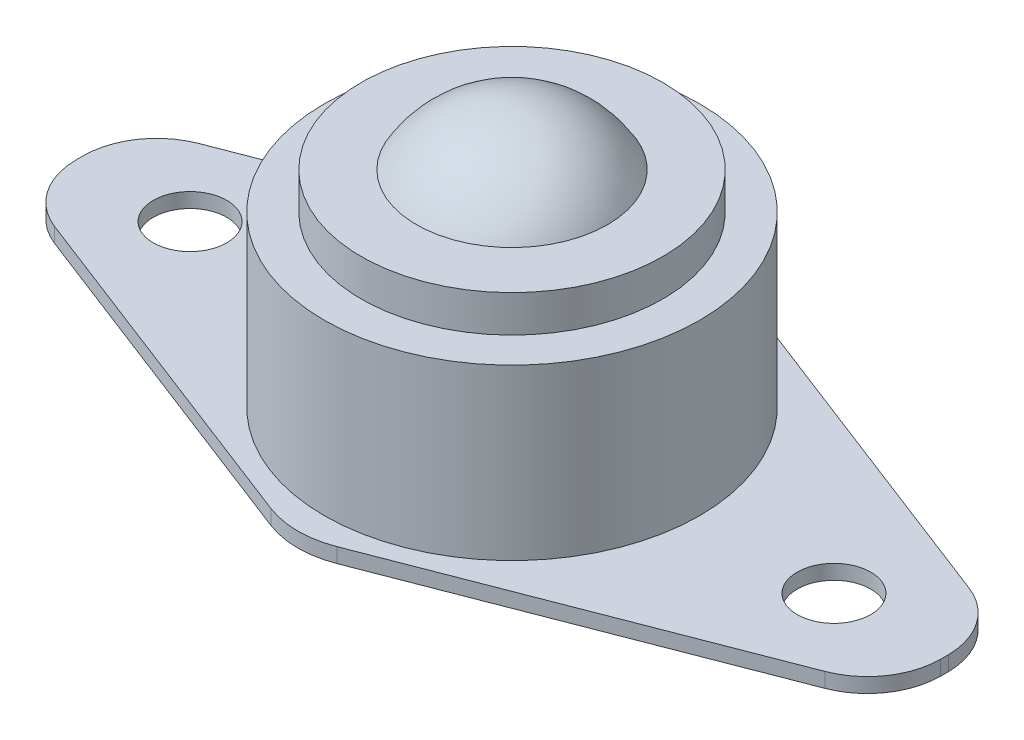
ISO-10303-21;
HEADER;
FILE_DESCRIPTION(('STEP AP214'),'2;1');
FILE_NAME('part.step','',(''),(''),'','','');
FILE_SCHEMA(('AUTOMOTIVE_DESIGN { 1 0 10303 214 1 1 1 1 }'));
ENDSEC;
DATA;
#1=APPLICATION_CONTEXT('core data for automotive mechanical design processes');
#2=APPLICATION_PROTOCOL_DEFINITION('international standard','automotive_design',2000,#1);
#3=PRODUCT_CONTEXT('',#1,'mechanical');
#4=PRODUCT('Part','Part','',(#3));
#5=PRODUCT_RELATED_PRODUCT_CATEGORY('part','',(#4));
#6=PRODUCT_DEFINITION_FORMATION('','',#4);
#7=PRODUCT_DEFINITION_CONTEXT('part definition',#1,'design');
#8=PRODUCT_DEFINITION('design','',#6,#7);
#9=PRODUCT_DEFINITION_SHAPE('','',#8);
#10=(LENGTH_UNIT() NAMED_UNIT(*) SI_UNIT(.MILLI.,.METRE.));
#11=(NAMED_UNIT(*) PLANE_ANGLE_UNIT() SI_UNIT($,.RADIAN.));
#12=(NAMED_UNIT(*) SI_UNIT($,.STERADIAN.) SOLID_ANGLE_UNIT());
#13=UNCERTAINTY_MEASURE_WITH_UNIT(LENGTH_MEASURE(1.E-05),#10,'distance_accuracy_value','');
#14=(GEOMETRIC_REPRESENTATION_CONTEXT(3) GLOBAL_UNCERTAINTY_ASSIGNED_CONTEXT((#13)) GLOBAL_UNIT_ASSIGNED_CONTEXT((#10,
#11,#12)) REPRESENTATION_CONTEXT('',''));
#15=CARTESIAN_POINT('',(0.,0.,0.));
#16=DIRECTION('',(0.,0.,1.));
#17=DIRECTION('',(1.,0.,0.));
#18=AXIS2_PLACEMENT_3D('',#15,#16,#17);
#19=CARTESIAN_POINT('',(-10.1961524227066,0.799999999999998,0.));
#20=DIRECTION('',(0.,-1.,0.));
#21=DIRECTION('',(0.,0.,-1.));
#22=AXIS2_PLACEMENT_3D('',#19,#20,#21);
#23=PLANE('',#22);
#24=CARTESIAN_POINT('',(0.,0.799999999999999,0.));
#25=DIRECTION('',(0.,-1.,0.));
#26=DIRECTION('',(0.,0.,-1.));
#27=AXIS2_PLACEMENT_3D('',#24,#25,#26);
#28=CIRCLE('',#27,10.1961524227066);
#29=CARTESIAN_POINT('',(0.,0.799999999999999,-10.1961524227066));
#30=VERTEX_POINT('',#29);
#31=EDGE_CURVE('E143',#30,#30,#28,.T.);
#32=ORIENTED_EDGE('',*,*,#31,.T.);
#33=EDGE_LOOP('',(#32));
#34=FACE_BOUND('',#33,.T.);
#35=CARTESIAN_POINT('',(17.5,0.799999999999998,0.));
#36=DIRECTION('',(0.,-1.,0.));
#37=DIRECTION('',(0.,0.,-1.));
#38=AXIS2_PLACEMENT_3D('',#35,#36,#37);
#39=CIRCLE('',#38,2.);
#40=CARTESIAN_POINT('',(17.5,0.799999999999998,2.));
#41=VERTEX_POINT('',#40);
#42=EDGE_CURVE('E210',#41,#41,#39,.T.);
#43=ORIENTED_EDGE('',*,*,#42,.T.);
#44=EDGE_LOOP('',(#43));
#45=FACE_BOUND('',#44,.T.);
#46=CARTESIAN_POINT('',(-17.5,0.799999999999998,0.));
#47=DIRECTION('',(0.,-1.,0.));
#48=DIRECTION('',(0.,0.,-1.));
#49=AXIS2_PLACEMENT_3D('',#46,#47,#48);
#50=CIRCLE('',#49,2.);
#51=CARTESIAN_POINT('',(-17.5,0.799999999999998,2.));
#52=VERTEX_POINT('',#51);
#53=EDGE_CURVE('E214',#52,#52,#50,.T.);
#54=ORIENTED_EDGE('',*,*,#53,.T.);
#55=EDGE_LOOP('',(#54));
#56=FACE_BOUND('',#55,.T.);
#57=DIRECTION('',(0.932868850992347,0.,0.360216194594604));
#58=VECTOR('',#57,1.);
#59=CARTESIAN_POINT('',(-12.9055570686898,0.799999999999998,7.01667286729346));
#60=LINE('',#59,#58);
#61=CARTESIAN_POINT('',(-20.9400080375723,0.799999999999998,3.91426533102604));
#62=VERTEX_POINT('',#61);
#63=CARTESIAN_POINT('',(-1.80108097297302,0.799999999999998,11.3045340365359));
#64=VERTEX_POINT('',#63);
#65=EDGE_CURVE('E196',#62,#64,#60,.T.);
#66=ORIENTED_EDGE('',*,*,#65,.T.);
#67=CARTESIAN_POINT('',(0.,0.799999999999999,6.64018978157411));
#68=DIRECTION('',(0.,-1.,0.));
#69=DIRECTION('',(0.,0.,-1.));
#70=AXIS2_PLACEMENT_3D('',#67,#68,#69);
#71=CIRCLE('',#70,5.);
#72=CARTESIAN_POINT('',(1.80108097297302,0.799999999999998,11.3045340365358));
#73=VERTEX_POINT('',#72);
#74=EDGE_CURVE('E177',#64,#73,#71,.F.);
#75=ORIENTED_EDGE('',*,*,#74,.T.);
#76=DIRECTION('',(0.932868850992347,0.,-0.360216194594604));
#77=VECTOR('',#76,1.);
#78=CARTESIAN_POINT('',(-4.84072984724251,0.799999999999998,13.8691901683493));
#79=LINE('',#78,#77);
#80=CARTESIAN_POINT('',(20.9400080375723,0.799999999999998,3.91426533102604));
#81=VERTEX_POINT('',#80);
#82=EDGE_CURVE('E204',#73,#81,#79,.T.);
#83=ORIENTED_EDGE('',*,*,#82,.T.);
#84=CARTESIAN_POINT('',(19.4991432591939,0.799999999999998,0.18278992705665));
#85=DIRECTION('',(0.,-1.,0.));
#86=DIRECTION('',(0.,0.,-1.));
#87=AXIS2_PLACEMENT_3D('',#84,#85,#86);
#88=CIRCLE('',#87,4.);
#89=CARTESIAN_POINT('',(23.4989675174901,0.799999999999997,0.220285296709296));
#90=VERTEX_POINT('',#89);
#91=EDGE_CURVE('E142',#81,#90,#88,.F.);
#92=ORIENTED_EDGE('',*,*,#91,.T.);
#93=CARTESIAN_POINT('',(0.,0.799999999999997,0.));
#94=DIRECTION('',(0.,-1.,0.));
#95=DIRECTION('',(0.,0.,-1.));
#96=AXIS2_PLACEMENT_3D('',#93,#94,#95);
#97=CIRCLE('',#96,23.5);
#98=CARTESIAN_POINT('',(23.4989675174901,0.799999999999997,-0.220285296709296));
#99=VERTEX_POINT('',#98);
#100=EDGE_CURVE('E127',#99,#90,#97,.T.);
#101=ORIENTED_EDGE('',*,*,#100,.F.);
#102=CARTESIAN_POINT('',(19.4991432591939,0.799999999999998,-0.18278992705665));
#103=DIRECTION('',(0.,-1.,0.));
#104=DIRECTION('',(0.,0.,-1.));
#105=AXIS2_PLACEMENT_3D('',#102,#103,#104);
#106=CIRCLE('',#105,4.);
#107=CARTESIAN_POINT('',(20.9400080375723,0.799999999999998,-3.91426533102604));
#108=VERTEX_POINT('',#107);
#109=EDGE_CURVE('E139',#99,#108,#106,.F.);
#110=ORIENTED_EDGE('',*,*,#109,.T.);
#111=DIRECTION('',(0.932868850992347,0.,0.360216194594604));
#112=VECTOR('',#111,1.);
#113=CARTESIAN_POINT('',(-4.84072984724251,0.799999999999998,-13.8691901683493));
#114=LINE('',#113,#112);
#115=CARTESIAN_POINT('',(1.80108097297302,0.799999999999998,-11.3045340365359));
#116=VERTEX_POINT('',#115);
#117=EDGE_CURVE('E206',#116,#108,#114,.T.);
#118=ORIENTED_EDGE('',*,*,#117,.F.);
#119=CARTESIAN_POINT('',(0.,0.799999999999999,-6.64018978157411));
#120=DIRECTION('',(0.,-1.,0.));
#121=DIRECTION('',(0.,0.,-1.));
#122=AXIS2_PLACEMENT_3D('',#119,#120,#121);
#123=CIRCLE('',#122,5.);
#124=CARTESIAN_POINT('',(-1.80108097297302,0.799999999999998,-11.3045340365359));
#125=VERTEX_POINT('',#124);
#126=EDGE_CURVE('E48',#116,#125,#123,.F.);
#127=ORIENTED_EDGE('',*,*,#126,.T.);
#128=DIRECTION('',(0.932868850992347,0.,-0.360216194594604));
#129=VECTOR('',#128,1.);
#130=CARTESIAN_POINT('',(-12.9055570686898,0.799999999999998,-7.01667286729346));
#131=LINE('',#130,#129);
#132=CARTESIAN_POINT('',(-20.9400080375723,0.799999999999998,-3.91426533102604));
#133=VERTEX_POINT('',#132);
#134=EDGE_CURVE('E186',#133,#125,#131,.T.);
#135=ORIENTED_EDGE('',*,*,#134,.F.);
#136=CARTESIAN_POINT('',(-19.4991432591939,0.799999999999998,-0.18278992705665));
#137=DIRECTION('',(0.,-1.,0.));
#138=DIRECTION('',(0.,0.,-1.));
#139=AXIS2_PLACEMENT_3D('',#136,#137,#138);
#140=CIRCLE('',#139,4.);
#141=CARTESIAN_POINT('',(-23.4989675174901,0.799999999999997,-0.220285296709296));
#142=VERTEX_POINT('',#141);
#143=EDGE_CURVE('E152',#133,#142,#140,.F.);
#144=ORIENTED_EDGE('',*,*,#143,.T.);
#145=CARTESIAN_POINT('',(-23.4989675174901,0.799999999999997,0.220285296709296));
#146=VERTEX_POINT('',#145);
#147=EDGE_CURVE('E144',#146,#142,#97,.T.);
#148=ORIENTED_EDGE('',*,*,#147,.F.);
#149=CARTESIAN_POINT('',(-19.4991432591939,0.799999999999998,0.18278992705665));
#150=DIRECTION('',(0.,-1.,0.));
#151=DIRECTION('',(0.,0.,-1.));
#152=AXIS2_PLACEMENT_3D('',#149,#150,#151);
#153=CIRCLE('',#152,4.);
#154=EDGE_CURVE('E149',#146,#62,#153,.F.);
#155=ORIENTED_EDGE('',*,*,#154,.T.);
#156=EDGE_LOOP('',(#66,#75,#83,#92,#101,#110,#118,#127,#135,#144,#148,#155));
#157=FACE_BOUND('',#156,.T.);
#158=ADVANCED_FACE('F33',(#34,#45,#56,#157),#23,.F.);
#159=CARTESIAN_POINT('',(0.,0.,0.));
#160=DIRECTION('',(0.,-1.,0.));
#161=DIRECTION('',(0.,0.,-1.));
#162=AXIS2_PLACEMENT_3D('',#159,#160,#161);
#163=CYLINDRICAL_SURFACE('',#162,23.5);
#164=CARTESIAN_POINT('',(0.,0.,0.));
#165=DIRECTION('',(0.,-1.,0.));
#166=DIRECTION('',(0.,0.,-1.));
#167=AXIS2_PLACEMENT_3D('',#164,#165,#166);
#168=CIRCLE('',#167,23.5);
#169=CARTESIAN_POINT('',(-23.4989675174901,0.,0.220285296709296));
#170=VERTEX_POINT('',#169);
#171=CARTESIAN_POINT('',(-23.4989675174901,0.,-0.220285296709296));
#172=VERTEX_POINT('',#171);
#173=EDGE_CURVE('E217',#170,#172,#168,.T.);
#174=ORIENTED_EDGE('',*,*,#173,.F.);
#175=DIRECTION('',(0.,-1.,0.));
#176=VECTOR('',#175,1.);
#177=CARTESIAN_POINT('',(-23.4989675174901,0.,0.220285296709296));
#178=LINE('',#177,#176);
#179=EDGE_CURVE('E163',#170,#146,#178,.F.);
#180=ORIENTED_EDGE('',*,*,#179,.T.);
#181=ORIENTED_EDGE('',*,*,#147,.T.);
#182=DIRECTION('',(0.,-1.,0.));
#183=VECTOR('',#182,1.);
#184=CARTESIAN_POINT('',(-23.4989675174901,0.,-0.220285296709296));
#185=LINE('',#184,#183);
#186=EDGE_CURVE('E160',#142,#172,#185,.T.);
#187=ORIENTED_EDGE('',*,*,#186,.T.);
#188=EDGE_LOOP('',(#174,#180,#181,#187));
#189=FACE_BOUND('',#188,.T.);
#190=ADVANCED_FACE('F255',(#189),#163,.T.);
#191=ORIENTED_EDGE('',*,*,#100,.T.);
#192=DIRECTION('',(0.,-1.,0.));
#193=VECTOR('',#192,1.);
#194=CARTESIAN_POINT('',(23.4989675174901,0.,0.220285296709296));
#195=LINE('',#194,#193);
#196=CARTESIAN_POINT('',(23.4989675174901,0.,0.220285296709296));
#197=VERTEX_POINT('',#196);
#198=EDGE_CURVE('E134',#90,#197,#195,.T.);
#199=ORIENTED_EDGE('',*,*,#198,.T.);
#200=CARTESIAN_POINT('',(23.4989675174901,0.,-0.220285296709296));
#201=VERTEX_POINT('',#200);
#202=EDGE_CURVE('E130',#201,#197,#168,.T.);
#203=ORIENTED_EDGE('',*,*,#202,.F.);
#204=DIRECTION('',(0.,-1.,0.));
#205=VECTOR('',#204,1.);
#206=CARTESIAN_POINT('',(23.4989675174901,0.,-0.220285296709296));
#207=LINE('',#206,#205);
#208=EDGE_CURVE('E123',#201,#99,#207,.F.);
#209=ORIENTED_EDGE('',*,*,#208,.T.);
#210=EDGE_LOOP('',(#191,#199,#203,#209));
#211=FACE_BOUND('',#210,.T.);
#212=ADVANCED_FACE('F125',(#211),#163,.T.);
#213=CARTESIAN_POINT('',(0.,0.,0.));
#214=DIRECTION('',(0.,1.,0.));
#215=DIRECTION('',(0.,0.,1.));
#216=AXIS2_PLACEMENT_3D('',#213,#214,#215);
#217=PLANE('',#216);
#218=CARTESIAN_POINT('',(17.5,0.,0.));
#219=DIRECTION('',(0.,1.,0.));
#220=DIRECTION('',(0.,0.,1.));
#221=AXIS2_PLACEMENT_3D('',#218,#219,#220);
#222=CIRCLE('',#221,2.);
#223=CARTESIAN_POINT('',(17.5,0.,2.));
#224=VERTEX_POINT('',#223);
#225=EDGE_CURVE('E209',#224,#224,#222,.T.);
#226=ORIENTED_EDGE('',*,*,#225,.T.);
#227=EDGE_LOOP('',(#226));
#228=FACE_BOUND('',#227,.T.);
#229=CARTESIAN_POINT('',(-17.5,0.,0.));
#230=DIRECTION('',(0.,1.,0.));
#231=DIRECTION('',(0.,0.,1.));
#232=AXIS2_PLACEMENT_3D('',#229,#230,#231);
#233=CIRCLE('',#232,2.);
#234=CARTESIAN_POINT('',(-17.5,0.,2.));
#235=VERTEX_POINT('',#234);
#236=EDGE_CURVE('E213',#235,#235,#233,.T.);
#237=ORIENTED_EDGE('',*,*,#236,.T.);
#238=EDGE_LOOP('',(#237));
#239=FACE_BOUND('',#238,.T.);
#240=DIRECTION('',(0.932868850992347,0.,-0.360216194594604));
#241=VECTOR('',#240,1.);
#242=CARTESIAN_POINT('',(0.,0.,12.));
#243=LINE('',#242,#241);
#244=CARTESIAN_POINT('',(1.80108097297302,0.,11.3045340365358));
#245=VERTEX_POINT('',#244);
#246=CARTESIAN_POINT('',(20.9400080375723,0.,3.91426533102604));
#247=VERTEX_POINT('',#246);
#248=EDGE_CURVE('E194',#245,#247,#243,.T.);
#249=ORIENTED_EDGE('',*,*,#248,.F.);
#250=CARTESIAN_POINT('',(0.,0.,6.64018978157411));
#251=DIRECTION('',(0.,1.,0.));
#252=DIRECTION('',(0.,0.,1.));
#253=AXIS2_PLACEMENT_3D('',#250,#251,#252);
#254=CIRCLE('',#253,5.);
#255=CARTESIAN_POINT('',(-1.80108097297302,0.,11.3045340365359));
#256=VERTEX_POINT('',#255);
#257=EDGE_CURVE('E172',#245,#256,#254,.F.);
#258=ORIENTED_EDGE('',*,*,#257,.T.);
#259=DIRECTION('',(0.932868850992347,0.,0.360216194594604));
#260=VECTOR('',#259,1.);
#261=CARTESIAN_POINT('',(-23.3077240416133,0.,3.));
#262=LINE('',#261,#260);
#263=CARTESIAN_POINT('',(-20.9400080375723,0.,3.91426533102604));
#264=VERTEX_POINT('',#263);
#265=EDGE_CURVE('E198',#264,#256,#262,.T.);
#266=ORIENTED_EDGE('',*,*,#265,.F.);
#267=CARTESIAN_POINT('',(-19.4991432591939,0.,0.18278992705665));
#268=DIRECTION('',(0.,1.,0.));
#269=DIRECTION('',(0.,0.,1.));
#270=AXIS2_PLACEMENT_3D('',#267,#268,#269);
#271=CIRCLE('',#270,4.);
#272=EDGE_CURVE('E239',#264,#170,#271,.F.);
#273=ORIENTED_EDGE('',*,*,#272,.T.);
#274=ORIENTED_EDGE('',*,*,#173,.T.);
#275=CARTESIAN_POINT('',(-19.4991432591939,0.,-0.18278992705665));
#276=DIRECTION('',(0.,1.,0.));
#277=DIRECTION('',(0.,0.,1.));
#278=AXIS2_PLACEMENT_3D('',#275,#276,#277);
#279=CIRCLE('',#278,4.);
#280=CARTESIAN_POINT('',(-20.9400080375723,0.,-3.91426533102604));
#281=VERTEX_POINT('',#280);
#282=EDGE_CURVE('E192',#172,#281,#279,.F.);
#283=ORIENTED_EDGE('',*,*,#282,.T.);
#284=DIRECTION('',(0.932868850992347,0.,-0.360216194594604));
#285=VECTOR('',#284,1.);
#286=CARTESIAN_POINT('',(-23.3077240416133,0.,-3.));
#287=LINE('',#286,#285);
#288=CARTESIAN_POINT('',(-1.80108097297302,0.,-11.3045340365359));
#289=VERTEX_POINT('',#288);
#290=EDGE_CURVE('E184',#281,#289,#287,.T.);
#291=ORIENTED_EDGE('',*,*,#290,.T.);
#292=CARTESIAN_POINT('',(0.,0.,-6.64018978157411));
#293=DIRECTION('',(0.,1.,0.));
#294=DIRECTION('',(0.,0.,1.));
#295=AXIS2_PLACEMENT_3D('',#292,#293,#294);
#296=CIRCLE('',#295,5.);
#297=CARTESIAN_POINT('',(1.80108097297302,0.,-11.3045340365358));
#298=VERTEX_POINT('',#297);
#299=EDGE_CURVE('E170',#289,#298,#296,.F.);
#300=ORIENTED_EDGE('',*,*,#299,.T.);
#301=DIRECTION('',(0.932868850992347,0.,0.360216194594604));
#302=VECTOR('',#301,1.);
#303=CARTESIAN_POINT('',(0.,0.,-12.));
#304=LINE('',#303,#302);
#305=CARTESIAN_POINT('',(20.9400080375723,0.,-3.91426533102604));
#306=VERTEX_POINT('',#305);
#307=EDGE_CURVE('E193',#298,#306,#304,.T.);
#308=ORIENTED_EDGE('',*,*,#307,.T.);
#309=CARTESIAN_POINT('',(19.4991432591939,0.,-0.18278992705665));
#310=DIRECTION('',(0.,1.,0.));
#311=DIRECTION('',(0.,0.,1.));
#312=AXIS2_PLACEMENT_3D('',#309,#310,#311);
#313=CIRCLE('',#312,4.);
#314=EDGE_CURVE('E241',#306,#201,#313,.F.);
#315=ORIENTED_EDGE('',*,*,#314,.T.);
#316=ORIENTED_EDGE('',*,*,#202,.T.);
#317=CARTESIAN_POINT('',(19.4991432591939,0.,0.18278992705665));
#318=DIRECTION('',(0.,1.,0.));
#319=DIRECTION('',(0.,0.,1.));
#320=AXIS2_PLACEMENT_3D('',#317,#318,#319);
#321=CIRCLE('',#320,4.);
#322=EDGE_CURVE('E243',#197,#247,#321,.F.);
#323=ORIENTED_EDGE('',*,*,#322,.T.);
#324=EDGE_LOOP('',(#249,#258,#266,#273,#274,#283,#291,#300,#308,#315,#316,#323));
#325=FACE_BOUND('',#324,.T.);
#326=ADVANCED_FACE('F190',(#228,#239,#325),#217,.F.);
#327=CARTESIAN_POINT('',(0.,9.,0.));
#328=DIRECTION('',(0.,-1.,0.));
#329=DIRECTION('',(1.,0.,0.));
#330=AXIS2_PLACEMENT_3D('',#327,#328,#329);
#331=SPHERICAL_SURFACE('',#330,6.);
#332=CARTESIAN_POINT('',(0.,12.,0.));
#333=DIRECTION('',(0.,-1.,0.));
#334=DIRECTION('',(0.,0.,-1.));
#335=AXIS2_PLACEMENT_3D('',#332,#333,#334);
#336=CIRCLE('',#335,5.19615242270663);
#337=CARTESIAN_POINT('',(0.,12.,-5.19615242270663));
#338=VERTEX_POINT('',#337);
#339=EDGE_CURVE('E135',#338,#338,#336,.T.);
#340=ORIENTED_EDGE('',*,*,#339,.F.);
#341=EDGE_LOOP('',(#340));
#342=FACE_BOUND('',#341,.T.);
#343=ADVANCED_FACE('F295',(#342),#331,.T.);
#344=CARTESIAN_POINT('',(-5.19615242270663,12.,0.));
#345=DIRECTION('',(0.,-1.,0.));
#346=DIRECTION('',(0.,0.,-1.));
#347=AXIS2_PLACEMENT_3D('',#344,#345,#346);
#348=PLANE('',#347);
#349=CARTESIAN_POINT('',(0.,12.,0.));
#350=DIRECTION('',(0.,-1.,0.));
#351=DIRECTION('',(0.,0.,-1.));
#352=AXIS2_PLACEMENT_3D('',#349,#350,#351);
#353=CIRCLE('',#352,8.19615242270663);
#354=CARTESIAN_POINT('',(0.,12.,-8.19615242270663));
#355=VERTEX_POINT('',#354);
#356=EDGE_CURVE('E228',#355,#355,#353,.T.);
#357=ORIENTED_EDGE('',*,*,#356,.F.);
#358=EDGE_LOOP('',(#357));
#359=FACE_BOUND('',#358,.T.);
#360=ORIENTED_EDGE('',*,*,#339,.T.);
#361=EDGE_LOOP('',(#360));
#362=FACE_BOUND('',#361,.T.);
#363=ADVANCED_FACE('F291',(#359,#362),#348,.F.);
#364=CARTESIAN_POINT('',(0.,0.,0.));
#365=DIRECTION('',(0.,-1.,0.));
#366=DIRECTION('',(0.,0.,-1.));
#367=AXIS2_PLACEMENT_3D('',#364,#365,#366);
#368=CYLINDRICAL_SURFACE('',#367,8.19615242270663);
#369=CARTESIAN_POINT('',(0.,10.,0.));
#370=DIRECTION('',(0.,-1.,0.));
#371=DIRECTION('',(0.,0.,-1.));
#372=AXIS2_PLACEMENT_3D('',#369,#370,#371);
#373=CIRCLE('',#372,8.19615242270663);
#374=CARTESIAN_POINT('',(0.,10.,-8.19615242270663));
#375=VERTEX_POINT('',#374);
#376=EDGE_CURVE('E225',#375,#375,#373,.T.);
#377=ORIENTED_EDGE('',*,*,#376,.F.);
#378=EDGE_LOOP('',(#377));
#379=FACE_BOUND('',#378,.T.);
#380=ORIENTED_EDGE('',*,*,#356,.T.);
#381=EDGE_LOOP('',(#380));
#382=FACE_BOUND('',#381,.T.);
#383=ADVANCED_FACE('F287',(#379,#382),#368,.T.);
#384=CARTESIAN_POINT('',(-8.19615242270663,10.,0.));
#385=DIRECTION('',(0.,-1.,0.));
#386=DIRECTION('',(0.,0.,-1.));
#387=AXIS2_PLACEMENT_3D('',#384,#385,#386);
#388=PLANE('',#387);
#389=CARTESIAN_POINT('',(0.,10.,0.));
#390=DIRECTION('',(0.,-1.,0.));
#391=DIRECTION('',(0.,0.,-1.));
#392=AXIS2_PLACEMENT_3D('',#389,#390,#391);
#393=CIRCLE('',#392,10.1961524227066);
#394=CARTESIAN_POINT('',(0.,10.,-10.1961524227066));
#395=VERTEX_POINT('',#394);
#396=EDGE_CURVE('E222',#395,#395,#393,.T.);
#397=ORIENTED_EDGE('',*,*,#396,.F.);
#398=EDGE_LOOP('',(#397));
#399=FACE_BOUND('',#398,.T.);
#400=ORIENTED_EDGE('',*,*,#376,.T.);
#401=EDGE_LOOP('',(#400));
#402=FACE_BOUND('',#401,.T.);
#403=ADVANCED_FACE('F283',(#399,#402),#388,.F.);
#404=CARTESIAN_POINT('',(0.,0.,0.));
#405=DIRECTION('',(0.,-1.,0.));
#406=DIRECTION('',(0.,0.,-1.));
#407=AXIS2_PLACEMENT_3D('',#404,#405,#406);
#408=CYLINDRICAL_SURFACE('',#407,10.1961524227066);
#409=ORIENTED_EDGE('',*,*,#31,.F.);
#410=EDGE_LOOP('',(#409));
#411=FACE_BOUND('',#410,.T.);
#412=ORIENTED_EDGE('',*,*,#396,.T.);
#413=EDGE_LOOP('',(#412));
#414=FACE_BOUND('',#413,.T.);
#415=ADVANCED_FACE('F279',(#411,#414),#408,.T.);
#416=CARTESIAN_POINT('',(17.5,-1.2E-05,0.));
#417=DIRECTION('',(0.,1.,0.));
#418=DIRECTION('',(0.,0.,1.));
#419=AXIS2_PLACEMENT_3D('',#416,#417,#418);
#420=CYLINDRICAL_SURFACE('',#419,2.);
#421=CARTESIAN_POINT('',(17.5,0.,2.));
#422=CARTESIAN_POINT('',(17.5,0.00833333333333188,2.));
#423=CARTESIAN_POINT('',(17.5,0.0166666666666652,2.));
#424=CARTESIAN_POINT('',(17.5,0.0333333333333319,2.));
#425=CARTESIAN_POINT('',(17.5,0.0416666666666652,2.));
#426=CARTESIAN_POINT('',(17.5,0.0583333333333319,2.));
#427=CARTESIAN_POINT('',(17.5,0.0666666666666652,2.));
#428=CARTESIAN_POINT('',(17.5,0.0833333333333318,2.));
#429=CARTESIAN_POINT('',(17.5,0.0916666666666652,2.));
#430=CARTESIAN_POINT('',(17.5,0.108333333333332,2.));
#431=CARTESIAN_POINT('',(17.5,0.116666666666665,2.));
#432=CARTESIAN_POINT('',(17.5,0.133333333333332,2.));
#433=CARTESIAN_POINT('',(17.5,0.141666666666665,2.));
#434=CARTESIAN_POINT('',(17.5,0.158333333333332,2.));
#435=CARTESIAN_POINT('',(17.5,0.166666666666665,2.));
#436=CARTESIAN_POINT('',(17.5,0.183333333333332,2.));
#437=CARTESIAN_POINT('',(17.5,0.191666666666665,2.));
#438=CARTESIAN_POINT('',(17.5,0.208333333333332,2.));
#439=CARTESIAN_POINT('',(17.5,0.216666666666665,2.));
#440=CARTESIAN_POINT('',(17.5,0.233333333333332,2.));
#441=CARTESIAN_POINT('',(17.5,0.241666666666665,2.));
#442=CARTESIAN_POINT('',(17.5,0.258333333333332,2.));
#443=CARTESIAN_POINT('',(17.5,0.266666666666665,2.));
#444=CARTESIAN_POINT('',(17.5,0.283333333333332,2.));
#445=CARTESIAN_POINT('',(17.5,0.291666666666665,2.));
#446=CARTESIAN_POINT('',(17.5,0.308333333333332,2.));
#447=CARTESIAN_POINT('',(17.5,0.316666666666665,2.));
#448=CARTESIAN_POINT('',(17.5,0.333333333333332,2.));
#449=CARTESIAN_POINT('',(17.5,0.341666666666665,2.));
#450=CARTESIAN_POINT('',(17.5,0.358333333333332,2.));
#451=CARTESIAN_POINT('',(17.5,0.366666666666665,2.));
#452=CARTESIAN_POINT('',(17.5,0.383333333333332,2.));
#453=CARTESIAN_POINT('',(17.5,0.391666666666665,2.));
#454=CARTESIAN_POINT('',(17.5,0.408333333333332,2.));
#455=CARTESIAN_POINT('',(17.5,0.416666666666665,2.));
#456=CARTESIAN_POINT('',(17.5,0.433333333333332,2.));
#457=CARTESIAN_POINT('',(17.5,0.441666666666665,2.));
#458=CARTESIAN_POINT('',(17.5,0.458333333333332,2.));
#459=CARTESIAN_POINT('',(17.5,0.466666666666665,2.));
#460=CARTESIAN_POINT('',(17.5,0.483333333333332,2.));
#461=CARTESIAN_POINT('',(17.5,0.491666666666665,2.));
#462=CARTESIAN_POINT('',(17.5,0.508333333333332,2.));
#463=CARTESIAN_POINT('',(17.5,0.516666666666665,2.));
#464=CARTESIAN_POINT('',(17.5,0.533333333333332,2.));
#465=CARTESIAN_POINT('',(17.5,0.541666666666665,2.));
#466=CARTESIAN_POINT('',(17.5,0.558333333333331,2.));
#467=CARTESIAN_POINT('',(17.5,0.566666666666665,2.));
#468=CARTESIAN_POINT('',(17.5,0.583333333333331,2.));
#469=CARTESIAN_POINT('',(17.5,0.591666666666665,2.));
#470=CARTESIAN_POINT('',(17.5,0.608333333333332,2.));
#471=CARTESIAN_POINT('',(17.5,0.616666666666665,2.));
#472=CARTESIAN_POINT('',(17.5,0.633333333333331,2.));
#473=CARTESIAN_POINT('',(17.5,0.641666666666665,2.));
#474=CARTESIAN_POINT('',(17.5,0.658333333333332,2.));
#475=CARTESIAN_POINT('',(17.5,0.666666666666665,2.));
#476=CARTESIAN_POINT('',(17.5,0.683333333333331,2.));
#477=CARTESIAN_POINT('',(17.5,0.691666666666665,2.));
#478=CARTESIAN_POINT('',(17.5,0.708333333333331,2.));
#479=CARTESIAN_POINT('',(17.5,0.716666666666665,2.));
#480=CARTESIAN_POINT('',(17.5,0.733333333333331,2.));
#481=CARTESIAN_POINT('',(17.5,0.741666666666665,2.));
#482=CARTESIAN_POINT('',(17.5,0.758333333333331,2.));
#483=CARTESIAN_POINT('',(17.5,0.766666666666665,2.));
#484=CARTESIAN_POINT('',(17.5,0.783333333333331,2.));
#485=CARTESIAN_POINT('',(17.5,0.791666666666665,2.));
#486=CARTESIAN_POINT('',(17.5,0.799999999999998,2.));
#487=B_SPLINE_CURVE_WITH_KNOTS('',3,(#421,#422,#423,#424,#425,#426,#427,#428,#429,#430,#431,
#432,#433,#434,#435,#436,#437,#438,#439,#440,#441,#442,#443,#444,#445,#446,#447,#448,#449,#450,
#451,#452,#453,#454,#455,#456,#457,#458,#459,#460,#461,#462,#463,#464,#465,#466,#467,#468,#469,
#470,#471,#472,#473,#474,#475,#476,#477,#478,#479,#480,#481,#482,#483,#484,#485,#486),
.UNSPECIFIED.,.F.,.F.,(4,2,2,2,2,2,2,2,2,2,2,2,2,2,2,2,2,2,2,2,2,2,2,2,2,2,2,2,2,2,2,2,4),(0.,
0.025,0.05,0.075,0.0999999999999999,0.125,0.15,0.175,0.2,0.225,0.25,0.275,0.3,0.325,0.35,0.375,
0.4,0.425,0.45,0.475,0.5,0.525,0.55,0.575,0.6,0.625,0.65,0.675,0.7,0.725,0.749999999999999,
0.775,0.799999999999999),.UNSPECIFIED.);
#488=EDGE_CURVE('BSEAM282',#224,#41,#487,.T.);
#489=ORIENTED_EDGE('',*,*,#225,.F.);
#490=ORIENTED_EDGE('',*,*,#42,.F.);
#491=ORIENTED_EDGE('',*,*,#488,.T.);
#492=ORIENTED_EDGE('',*,*,#488,.F.);
#493=EDGE_LOOP('',(#489,#491,#490,#492));
#494=FACE_BOUND('',#493,.T.);
#495=ADVANCED_FACE('F282',(#494),#420,.F.);
#496=CARTESIAN_POINT('',(-17.5,-1.2E-05,0.));
#497=DIRECTION('',(0.,1.,0.));
#498=DIRECTION('',(0.,0.,1.));
#499=AXIS2_PLACEMENT_3D('',#496,#497,#498);
#500=CYLINDRICAL_SURFACE('',#499,2.);
#501=CARTESIAN_POINT('',(-17.5,0.,2.));
#502=CARTESIAN_POINT('',(-17.5,0.00833333333333188,2.));
#503=CARTESIAN_POINT('',(-17.5,0.0166666666666652,2.));
#504=CARTESIAN_POINT('',(-17.5,0.0333333333333319,2.));
#505=CARTESIAN_POINT('',(-17.5,0.0416666666666652,2.));
#506=CARTESIAN_POINT('',(-17.5,0.0583333333333319,2.));
#507=CARTESIAN_POINT('',(-17.5,0.0666666666666652,2.));
#508=CARTESIAN_POINT('',(-17.5,0.0833333333333318,2.));
#509=CARTESIAN_POINT('',(-17.5,0.0916666666666652,2.));
#510=CARTESIAN_POINT('',(-17.5,0.108333333333332,2.));
#511=CARTESIAN_POINT('',(-17.5,0.116666666666665,2.));
#512=CARTESIAN_POINT('',(-17.5,0.133333333333332,2.));
#513=CARTESIAN_POINT('',(-17.5,0.141666666666665,2.));
#514=CARTESIAN_POINT('',(-17.5,0.158333333333332,2.));
#515=CARTESIAN_POINT('',(-17.5,0.166666666666665,2.));
#516=CARTESIAN_POINT('',(-17.5,0.183333333333332,2.));
#517=CARTESIAN_POINT('',(-17.5,0.191666666666665,2.));
#518=CARTESIAN_POINT('',(-17.5,0.208333333333332,2.));
#519=CARTESIAN_POINT('',(-17.5,0.216666666666665,2.));
#520=CARTESIAN_POINT('',(-17.5,0.233333333333332,2.));
#521=CARTESIAN_POINT('',(-17.5,0.241666666666665,2.));
#522=CARTESIAN_POINT('',(-17.5,0.258333333333332,2.));
#523=CARTESIAN_POINT('',(-17.5,0.266666666666665,2.));
#524=CARTESIAN_POINT('',(-17.5,0.283333333333332,2.));
#525=CARTESIAN_POINT('',(-17.5,0.291666666666665,2.));
#526=CARTESIAN_POINT('',(-17.5,0.308333333333332,2.));
#527=CARTESIAN_POINT('',(-17.5,0.316666666666665,2.));
#528=CARTESIAN_POINT('',(-17.5,0.333333333333332,2.));
#529=CARTESIAN_POINT('',(-17.5,0.341666666666665,2.));
#530=CARTESIAN_POINT('',(-17.5,0.358333333333332,2.));
#531=CARTESIAN_POINT('',(-17.5,0.366666666666665,2.));
#532=CARTESIAN_POINT('',(-17.5,0.383333333333332,2.));
#533=CARTESIAN_POINT('',(-17.5,0.391666666666665,2.));
#534=CARTESIAN_POINT('',(-17.5,0.408333333333332,2.));
#535=CARTESIAN_POINT('',(-17.5,0.416666666666665,2.));
#536=CARTESIAN_POINT('',(-17.5,0.433333333333332,2.));
#537=CARTESIAN_POINT('',(-17.5,0.441666666666665,2.));
#538=CARTESIAN_POINT('',(-17.5,0.458333333333332,2.));
#539=CARTESIAN_POINT('',(-17.5,0.466666666666665,2.));
#540=CARTESIAN_POINT('',(-17.5,0.483333333333332,2.));
#541=CARTESIAN_POINT('',(-17.5,0.491666666666665,2.));
#542=CARTESIAN_POINT('',(-17.5,0.508333333333332,2.));
#543=CARTESIAN_POINT('',(-17.5,0.516666666666665,2.));
#544=CARTESIAN_POINT('',(-17.5,0.533333333333332,2.));
#545=CARTESIAN_POINT('',(-17.5,0.541666666666665,2.));
#546=CARTESIAN_POINT('',(-17.5,0.558333333333331,2.));
#547=CARTESIAN_POINT('',(-17.5,0.566666666666665,2.));
#548=CARTESIAN_POINT('',(-17.5,0.583333333333331,2.));
#549=CARTESIAN_POINT('',(-17.5,0.591666666666665,2.));
#550=CARTESIAN_POINT('',(-17.5,0.608333333333332,2.));
#551=CARTESIAN_POINT('',(-17.5,0.616666666666665,2.));
#552=CARTESIAN_POINT('',(-17.5,0.633333333333331,2.));
#553=CARTESIAN_POINT('',(-17.5,0.641666666666665,2.));
#554=CARTESIAN_POINT('',(-17.5,0.658333333333332,2.));
#555=CARTESIAN_POINT('',(-17.5,0.666666666666665,2.));
#556=CARTESIAN_POINT('',(-17.5,0.683333333333331,2.));
#557=CARTESIAN_POINT('',(-17.5,0.691666666666665,2.));
#558=CARTESIAN_POINT('',(-17.5,0.708333333333331,2.));
#559=CARTESIAN_POINT('',(-17.5,0.716666666666665,2.));
#560=CARTESIAN_POINT('',(-17.5,0.733333333333331,2.));
#561=CARTESIAN_POINT('',(-17.5,0.741666666666665,2.));
#562=CARTESIAN_POINT('',(-17.5,0.758333333333331,2.));
#563=CARTESIAN_POINT('',(-17.5,0.766666666666665,2.));
#564=CARTESIAN_POINT('',(-17.5,0.783333333333331,2.));
#565=CARTESIAN_POINT('',(-17.5,0.791666666666665,2.));
#566=CARTESIAN_POINT('',(-17.5,0.799999999999998,2.));
#567=B_SPLINE_CURVE_WITH_KNOTS('',3,(#501,#502,#503,#504,#505,#506,#507,#508,#509,#510,#511,
#512,#513,#514,#515,#516,#517,#518,#519,#520,#521,#522,#523,#524,#525,#526,#527,#528,#529,#530,
#531,#532,#533,#534,#535,#536,#537,#538,#539,#540,#541,#542,#543,#544,#545,#546,#547,#548,#549,
#550,#551,#552,#553,#554,#555,#556,#557,#558,#559,#560,#561,#562,#563,#564,#565,#566),
.UNSPECIFIED.,.F.,.F.,(4,2,2,2,2,2,2,2,2,2,2,2,2,2,2,2,2,2,2,2,2,2,2,2,2,2,2,2,2,2,2,2,4),(0.,
0.025,0.05,0.075,0.0999999999999999,0.125,0.15,0.175,0.2,0.225,0.25,0.275,0.3,0.325,0.35,0.375,
0.4,0.425,0.45,0.475,0.5,0.525,0.55,0.575,0.6,0.625,0.65,0.675,0.7,0.725,0.749999999999999,
0.775,0.799999999999999),.UNSPECIFIED.);
#568=EDGE_CURVE('BSEAM347',#235,#52,#567,.T.);
#569=ORIENTED_EDGE('',*,*,#236,.F.);
#570=ORIENTED_EDGE('',*,*,#53,.F.);
#571=ORIENTED_EDGE('',*,*,#568,.T.);
#572=ORIENTED_EDGE('',*,*,#568,.F.);
#573=EDGE_LOOP('',(#569,#571,#570,#572));
#574=FACE_BOUND('',#573,.T.);
#575=ADVANCED_FACE('F347',(#574),#500,.F.);
#576=CARTESIAN_POINT('',(0.,15.,12.));
#577=DIRECTION('',(-0.360216194594604,0.,-0.932868850992347));
#578=DIRECTION('',(-0.932868850992347,0.,0.360216194594604));
#579=AXIS2_PLACEMENT_3D('',#576,#577,#578);
#580=PLANE('',#579);
#581=ORIENTED_EDGE('',*,*,#82,.F.);
#582=DIRECTION('',(0.,-1.,0.));
#583=VECTOR('',#582,1.);
#584=CARTESIAN_POINT('',(1.80108097297302,15.,11.3045340365358));
#585=LINE('',#584,#583);
#586=EDGE_CURVE('E167',#73,#245,#585,.T.);
#587=ORIENTED_EDGE('',*,*,#586,.T.);
#588=ORIENTED_EDGE('',*,*,#248,.T.);
#589=DIRECTION('',(0.,-1.,0.));
#590=VECTOR('',#589,1.);
#591=CARTESIAN_POINT('',(20.9400080375723,15.,3.91426533102604));
#592=LINE('',#591,#590);
#593=EDGE_CURVE('E246',#247,#81,#592,.F.);
#594=ORIENTED_EDGE('',*,*,#593,.T.);
#595=EDGE_LOOP('',(#581,#587,#588,#594));
#596=FACE_BOUND('',#595,.T.);
#597=ADVANCED_FACE('F342',(#596),#580,.F.);
#598=CARTESIAN_POINT('',(-23.3077240416133,15.,3.));
#599=DIRECTION('',(0.360216194594604,0.,-0.932868850992347));
#600=DIRECTION('',(-0.932868850992347,0.,-0.360216194594604));
#601=AXIS2_PLACEMENT_3D('',#598,#599,#600);
#602=PLANE('',#601);
#603=ORIENTED_EDGE('',*,*,#265,.T.);
#604=DIRECTION('',(0.,-1.,0.));
#605=VECTOR('',#604,1.);
#606=CARTESIAN_POINT('',(-1.80108097297302,15.,11.3045340365359));
#607=LINE('',#606,#605);
#608=EDGE_CURVE('E174',#256,#64,#607,.F.);
#609=ORIENTED_EDGE('',*,*,#608,.T.);
#610=ORIENTED_EDGE('',*,*,#65,.F.);
#611=DIRECTION('',(0.,-1.,0.));
#612=VECTOR('',#611,1.);
#613=CARTESIAN_POINT('',(-20.9400080375723,15.,3.91426533102604));
#614=LINE('',#613,#612);
#615=EDGE_CURVE('E157',#62,#264,#614,.T.);
#616=ORIENTED_EDGE('',*,*,#615,.T.);
#617=EDGE_LOOP('',(#603,#609,#610,#616));
#618=FACE_BOUND('',#617,.T.);
#619=ADVANCED_FACE('F346',(#618),#602,.F.);
#620=CARTESIAN_POINT('',(-23.3077240416133,15.,-3.));
#621=DIRECTION('',(-0.360216194594604,0.,-0.932868850992347));
#622=DIRECTION('',(-0.932868850992347,0.,0.360216194594604));
#623=AXIS2_PLACEMENT_3D('',#620,#621,#622);
#624=PLANE('',#623);
#625=ORIENTED_EDGE('',*,*,#134,.T.);
#626=DIRECTION('',(0.,-1.,0.));
#627=VECTOR('',#626,1.);
#628=CARTESIAN_POINT('',(-1.80108097297302,15.,-11.3045340365359));
#629=LINE('',#628,#627);
#630=EDGE_CURVE('E41',#125,#289,#629,.T.);
#631=ORIENTED_EDGE('',*,*,#630,.T.);
#632=ORIENTED_EDGE('',*,*,#290,.F.);
#633=DIRECTION('',(0.,1.,0.));
#634=VECTOR('',#633,1.);
#635=CARTESIAN_POINT('',(-20.9400080375723,0.799999999999997,-3.91426533102604));
#636=LINE('',#635,#634);
#637=EDGE_CURVE('E165',#281,#133,#636,.T.);
#638=ORIENTED_EDGE('',*,*,#637,.T.);
#639=EDGE_LOOP('',(#625,#631,#632,#638));
#640=FACE_BOUND('',#639,.T.);
#641=ADVANCED_FACE('F183',(#640),#624,.T.);
#642=CARTESIAN_POINT('',(0.,15.,-12.));
#643=DIRECTION('',(0.360216194594604,0.,-0.932868850992347));
#644=DIRECTION('',(-0.932868850992347,0.,-0.360216194594604));
#645=AXIS2_PLACEMENT_3D('',#642,#643,#644);
#646=PLANE('',#645);
#647=ORIENTED_EDGE('',*,*,#307,.F.);
#648=DIRECTION('',(0.,-1.,0.));
#649=VECTOR('',#648,1.);
#650=CARTESIAN_POINT('',(1.80108097297302,15.,-11.3045340365358));
#651=LINE('',#650,#649);
#652=EDGE_CURVE('E11',#298,#116,#651,.F.);
#653=ORIENTED_EDGE('',*,*,#652,.T.);
#654=ORIENTED_EDGE('',*,*,#117,.T.);
#655=DIRECTION('',(0.,1.,0.));
#656=VECTOR('',#655,1.);
#657=CARTESIAN_POINT('',(20.9400080375723,0.,-3.91426533102604));
#658=LINE('',#657,#656);
#659=EDGE_CURVE('E148',#108,#306,#658,.F.);
#660=ORIENTED_EDGE('',*,*,#659,.T.);
#661=EDGE_LOOP('',(#647,#653,#654,#660));
#662=FACE_BOUND('',#661,.T.);
#663=ADVANCED_FACE('F303',(#662),#646,.T.);
#664=CARTESIAN_POINT('',(19.4991432591939,0.,0.18278992705665));
#665=DIRECTION('',(0.,-1.,0.));
#666=DIRECTION('',(0.,0.,-1.));
#667=AXIS2_PLACEMENT_3D('',#664,#665,#666);
#668=CYLINDRICAL_SURFACE('',#667,4.);
#669=ORIENTED_EDGE('',*,*,#91,.F.);
#670=ORIENTED_EDGE('',*,*,#593,.F.);
#671=ORIENTED_EDGE('',*,*,#322,.F.);
#672=ORIENTED_EDGE('',*,*,#198,.F.);
#673=EDGE_LOOP('',(#669,#670,#671,#672));
#674=FACE_BOUND('',#673,.T.);
#675=ADVANCED_FACE('F300',(#674),#668,.T.);
#676=CARTESIAN_POINT('',(19.4991432591939,0.,-0.18278992705665));
#677=DIRECTION('',(0.,-1.,0.));
#678=DIRECTION('',(0.,0.,-1.));
#679=AXIS2_PLACEMENT_3D('',#676,#677,#678);
#680=CYLINDRICAL_SURFACE('',#679,4.);
#681=ORIENTED_EDGE('',*,*,#109,.F.);
#682=ORIENTED_EDGE('',*,*,#208,.F.);
#683=ORIENTED_EDGE('',*,*,#314,.F.);
#684=ORIENTED_EDGE('',*,*,#659,.F.);
#685=EDGE_LOOP('',(#681,#682,#683,#684));
#686=FACE_BOUND('',#685,.T.);
#687=ADVANCED_FACE('F146',(#686),#680,.T.);
#688=CARTESIAN_POINT('',(-19.4991432591939,0.,0.18278992705665));
#689=DIRECTION('',(0.,-1.,0.));
#690=DIRECTION('',(0.,0.,-1.));
#691=AXIS2_PLACEMENT_3D('',#688,#689,#690);
#692=CYLINDRICAL_SURFACE('',#691,4.);
#693=ORIENTED_EDGE('',*,*,#154,.F.);
#694=ORIENTED_EDGE('',*,*,#179,.F.);
#695=ORIENTED_EDGE('',*,*,#272,.F.);
#696=ORIENTED_EDGE('',*,*,#615,.F.);
#697=EDGE_LOOP('',(#693,#694,#695,#696));
#698=FACE_BOUND('',#697,.T.);
#699=ADVANCED_FACE('F260',(#698),#692,.T.);
#700=CARTESIAN_POINT('',(-19.4991432591939,0.,-0.18278992705665));
#701=DIRECTION('',(0.,-1.,0.));
#702=DIRECTION('',(0.,0.,-1.));
#703=AXIS2_PLACEMENT_3D('',#700,#701,#702);
#704=CYLINDRICAL_SURFACE('',#703,4.);
#705=ORIENTED_EDGE('',*,*,#143,.F.);
#706=ORIENTED_EDGE('',*,*,#637,.F.);
#707=ORIENTED_EDGE('',*,*,#282,.F.);
#708=ORIENTED_EDGE('',*,*,#186,.F.);
#709=EDGE_LOOP('',(#705,#706,#707,#708));
#710=FACE_BOUND('',#709,.T.);
#711=ADVANCED_FACE('F257',(#710),#704,.T.);
#712=CARTESIAN_POINT('',(0.,15.,6.64018978157411));
#713=DIRECTION('',(0.,-1.,0.));
#714=DIRECTION('',(0.,0.,-1.));
#715=AXIS2_PLACEMENT_3D('',#712,#713,#714);
#716=CYLINDRICAL_SURFACE('',#715,5.);
#717=ORIENTED_EDGE('',*,*,#74,.F.);
#718=ORIENTED_EDGE('',*,*,#608,.F.);
#719=ORIENTED_EDGE('',*,*,#257,.F.);
#720=ORIENTED_EDGE('',*,*,#586,.F.);
#721=EDGE_LOOP('',(#717,#718,#719,#720));
#722=FACE_BOUND('',#721,.T.);
#723=ADVANCED_FACE('F259',(#722),#716,.T.);
#724=CARTESIAN_POINT('',(0.,15.,-6.64018978157411));
#725=DIRECTION('',(0.,-1.,0.));
#726=DIRECTION('',(0.,0.,-1.));
#727=AXIS2_PLACEMENT_3D('',#724,#725,#726);
#728=CYLINDRICAL_SURFACE('',#727,5.);
#729=ORIENTED_EDGE('',*,*,#126,.F.);
#730=ORIENTED_EDGE('',*,*,#652,.F.);
#731=ORIENTED_EDGE('',*,*,#299,.F.);
#732=ORIENTED_EDGE('',*,*,#630,.F.);
#733=EDGE_LOOP('',(#729,#730,#731,#732));
#734=FACE_BOUND('',#733,.T.);
#735=ADVANCED_FACE('F35',(#734),#728,.T.);
#736=CLOSED_SHELL('',(#158,#190,#212,#326,#343,#363,#383,#403,#415,#495,#575,#597,#619,#641,
#663,#675,#687,#699,#711,#723,#735));
#737=MANIFOLD_SOLID_BREP('B2',#736);
#738=ADVANCED_BREP_SHAPE_REPRESENTATION('',(#18,#737),#14);
#739=SHAPE_DEFINITION_REPRESENTATION(#9,#738);
ENDSEC;
END-ISO-10303-21;
